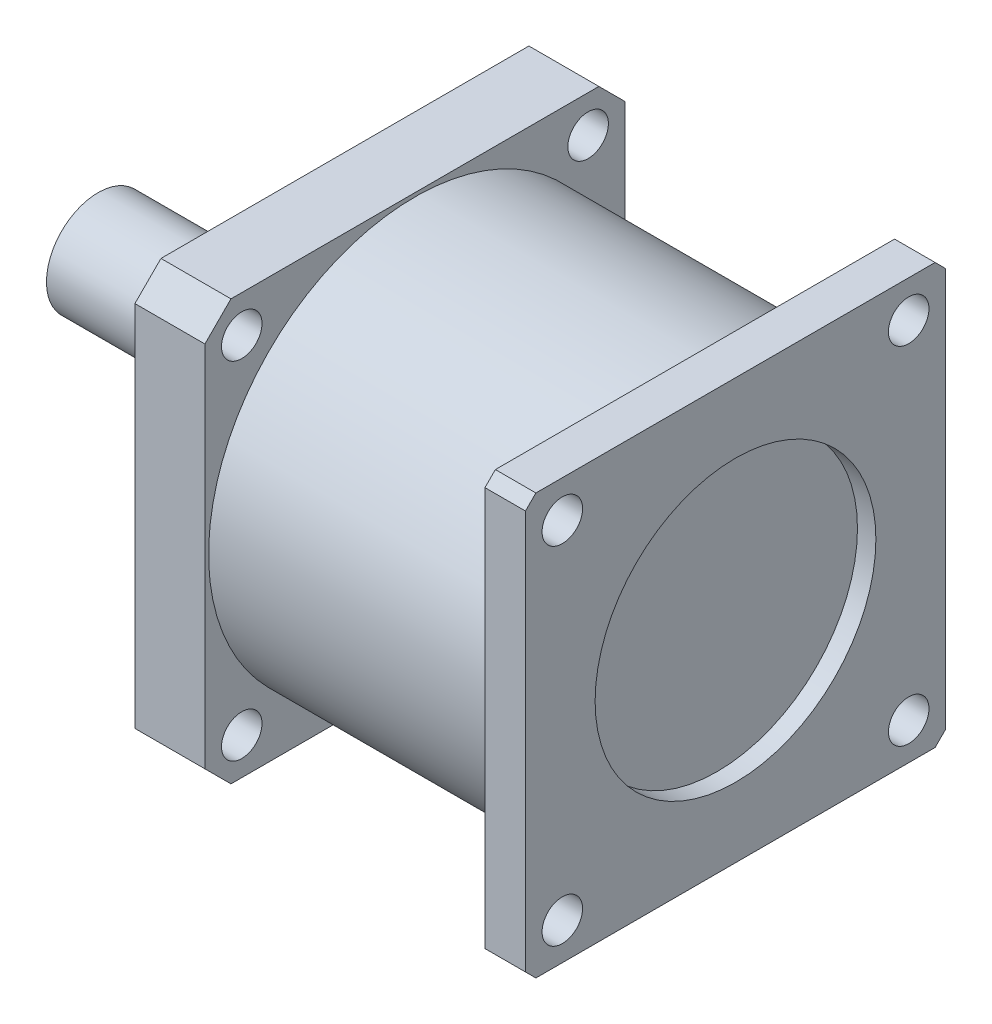
ISO-10303-21;
HEADER;
FILE_DESCRIPTION(('STEP AP214'),'2;1');
FILE_NAME('part.step','',(''),(''),'','','');
FILE_SCHEMA(('AUTOMOTIVE_DESIGN { 1 0 10303 214 1 1 1 1 }'));
ENDSEC;
DATA;
#1=APPLICATION_CONTEXT('core data for automotive mechanical design processes');
#2=APPLICATION_PROTOCOL_DEFINITION('international standard','automotive_design',2000,#1);
#3=PRODUCT_CONTEXT('',#1,'mechanical');
#4=PRODUCT('Part','Part','',(#3));
#5=PRODUCT_RELATED_PRODUCT_CATEGORY('part','',(#4));
#6=PRODUCT_DEFINITION_FORMATION('','',#4);
#7=PRODUCT_DEFINITION_CONTEXT('part definition',#1,'design');
#8=PRODUCT_DEFINITION('design','',#6,#7);
#9=PRODUCT_DEFINITION_SHAPE('','',#8);
#10=(LENGTH_UNIT() NAMED_UNIT(*) SI_UNIT(.MILLI.,.METRE.));
#11=(NAMED_UNIT(*) PLANE_ANGLE_UNIT() SI_UNIT($,.RADIAN.));
#12=(NAMED_UNIT(*) SI_UNIT($,.STERADIAN.) SOLID_ANGLE_UNIT());
#13=UNCERTAINTY_MEASURE_WITH_UNIT(LENGTH_MEASURE(1.E-05),#10,'distance_accuracy_value','');
#14=(GEOMETRIC_REPRESENTATION_CONTEXT(3) GLOBAL_UNCERTAINTY_ASSIGNED_CONTEXT((#13)) GLOBAL_UNIT_ASSIGNED_CONTEXT((#10,
#11,#12)) REPRESENTATION_CONTEXT('',''));
#15=CARTESIAN_POINT('',(0.,0.,0.));
#16=DIRECTION('',(0.,0.,1.));
#17=DIRECTION('',(1.,0.,0.));
#18=AXIS2_PLACEMENT_3D('',#15,#16,#17);
#19=CARTESIAN_POINT('',(43.5,28.5,-28.5));
#20=DIRECTION('',(0.,-1.,0.));
#21=DIRECTION('',(0.,0.,-1.));
#22=AXIS2_PLACEMENT_3D('',#19,#20,#21);
#23=PLANE('',#22);
#24=DIRECTION('',(1.,0.,0.));
#25=VECTOR('',#24,1.);
#26=CARTESIAN_POINT('',(38.,28.5000000000003,-27.0857864376266));
#27=LINE('',#26,#25);
#28=CARTESIAN_POINT('',(38.,28.5000000000003,-27.0857864376266));
#29=VERTEX_POINT('',#28);
#30=CARTESIAN_POINT('',(43.5,28.5000000000003,-27.0857864376266));
#31=VERTEX_POINT('',#30);
#32=EDGE_CURVE('E223',#29,#31,#27,.T.);
#33=ORIENTED_EDGE('',*,*,#32,.F.);
#34=DIRECTION('',(0.,0.,1.));
#35=VECTOR('',#34,1.);
#36=CARTESIAN_POINT('',(38.,28.5,-28.5));
#37=LINE('',#36,#35);
#38=CARTESIAN_POINT('',(38.,28.5,27.0857864376269));
#39=VERTEX_POINT('',#38);
#40=EDGE_CURVE('E276',#29,#39,#37,.T.);
#41=ORIENTED_EDGE('',*,*,#40,.T.);
#42=DIRECTION('',(1.,0.,0.));
#43=VECTOR('',#42,1.);
#44=CARTESIAN_POINT('',(38.,28.5,27.0857864376269));
#45=LINE('',#44,#43);
#46=CARTESIAN_POINT('',(43.5,28.5,27.0857864376269));
#47=VERTEX_POINT('',#46);
#48=EDGE_CURVE('E241',#39,#47,#45,.T.);
#49=ORIENTED_EDGE('',*,*,#48,.T.);
#50=DIRECTION('',(0.,0.,1.));
#51=VECTOR('',#50,1.);
#52=CARTESIAN_POINT('',(43.5,28.5,-28.5));
#53=LINE('',#52,#51);
#54=EDGE_CURVE('E260',#31,#47,#53,.T.);
#55=ORIENTED_EDGE('',*,*,#54,.F.);
#56=EDGE_LOOP('',(#33,#41,#49,#55));
#57=FACE_BOUND('',#56,.T.);
#58=ADVANCED_FACE('F39',(#57),#23,.F.);
#59=CARTESIAN_POINT('',(43.5,28.5,28.5));
#60=DIRECTION('',(0.,0.,-1.));
#61=DIRECTION('',(0.,1.,0.));
#62=AXIS2_PLACEMENT_3D('',#59,#60,#61);
#63=PLANE('',#62);
#64=DIRECTION('',(1.,0.,0.));
#65=VECTOR('',#64,1.);
#66=CARTESIAN_POINT('',(38.,-27.085786437627,28.4999999999999));
#67=LINE('',#66,#65);
#68=CARTESIAN_POINT('',(38.,-27.085786437627,28.4999999999999));
#69=VERTEX_POINT('',#68);
#70=CARTESIAN_POINT('',(43.5,-27.085786437627,28.4999999999999));
#71=VERTEX_POINT('',#70);
#72=EDGE_CURVE('E199',#69,#71,#67,.T.);
#73=ORIENTED_EDGE('',*,*,#72,.T.);
#74=DIRECTION('',(0.,-1.,0.));
#75=VECTOR('',#74,1.);
#76=CARTESIAN_POINT('',(43.5,28.5,28.5));
#77=LINE('',#76,#75);
#78=CARTESIAN_POINT('',(43.5,27.0857864376269,28.5));
#79=VERTEX_POINT('',#78);
#80=EDGE_CURVE('E264',#79,#71,#77,.T.);
#81=ORIENTED_EDGE('',*,*,#80,.F.);
#82=DIRECTION('',(1.,0.,0.));
#83=VECTOR('',#82,1.);
#84=CARTESIAN_POINT('',(38.,27.0857864376269,28.5));
#85=LINE('',#84,#83);
#86=CARTESIAN_POINT('',(38.,27.0857864376269,28.5));
#87=VERTEX_POINT('',#86);
#88=EDGE_CURVE('E237',#87,#79,#85,.T.);
#89=ORIENTED_EDGE('',*,*,#88,.F.);
#90=DIRECTION('',(0.,-1.,0.));
#91=VECTOR('',#90,1.);
#92=CARTESIAN_POINT('',(38.,28.5,28.5));
#93=LINE('',#92,#91);
#94=EDGE_CURVE('E279',#87,#69,#93,.T.);
#95=ORIENTED_EDGE('',*,*,#94,.T.);
#96=EDGE_LOOP('',(#73,#81,#89,#95));
#97=FACE_BOUND('',#96,.T.);
#98=ADVANCED_FACE('F461',(#97),#63,.F.);
#99=CARTESIAN_POINT('',(43.5,0.,0.));
#100=DIRECTION('',(1.,0.,0.));
#101=DIRECTION('',(0.,0.,-1.));
#102=AXIS2_PLACEMENT_3D('',#99,#100,#101);
#103=PLANE('',#102);
#104=CARTESIAN_POINT('',(43.5,-23.5000000000001,23.4999999999999));
#105=DIRECTION('',(1.,0.,0.));
#106=DIRECTION('',(0.,1.,0.));
#107=AXIS2_PLACEMENT_3D('',#104,#105,#106);
#108=CIRCLE('',#107,2.75);
#109=CARTESIAN_POINT('',(43.5,-20.7500000000001,23.4999999999999));
#110=VERTEX_POINT('',#109);
#111=EDGE_CURVE('E303',#110,#110,#108,.T.);
#112=ORIENTED_EDGE('',*,*,#111,.F.);
#113=EDGE_LOOP('',(#112));
#114=FACE_BOUND('',#113,.T.);
#115=CARTESIAN_POINT('',(43.5,-23.5,-23.5));
#116=DIRECTION('',(1.,0.,0.));
#117=DIRECTION('',(0.,0.,1.));
#118=AXIS2_PLACEMENT_3D('',#115,#116,#117);
#119=CIRCLE('',#118,2.75);
#120=CARTESIAN_POINT('',(43.5,-23.5,-20.75));
#121=VERTEX_POINT('',#120);
#122=EDGE_CURVE('E541',#121,#121,#119,.T.);
#123=ORIENTED_EDGE('',*,*,#122,.F.);
#124=EDGE_LOOP('',(#123));
#125=FACE_BOUND('',#124,.T.);
#126=CARTESIAN_POINT('',(43.5,23.5000000000002,-23.4999999999997));
#127=DIRECTION('',(1.,0.,0.));
#128=DIRECTION('',(0.,-1.,0.));
#129=AXIS2_PLACEMENT_3D('',#126,#127,#128);
#130=CIRCLE('',#129,2.75);
#131=CARTESIAN_POINT('',(43.5,20.7500000000002,-23.4999999999998));
#132=VERTEX_POINT('',#131);
#133=EDGE_CURVE('E545',#132,#132,#130,.T.);
#134=ORIENTED_EDGE('',*,*,#133,.F.);
#135=EDGE_LOOP('',(#134));
#136=FACE_BOUND('',#135,.T.);
#137=CARTESIAN_POINT('',(43.5,23.5,23.5));
#138=DIRECTION('',(1.,0.,0.));
#139=DIRECTION('',(0.,0.,-1.));
#140=AXIS2_PLACEMENT_3D('',#137,#138,#139);
#141=CIRCLE('',#140,2.75);
#142=CARTESIAN_POINT('',(43.5,23.5,20.75));
#143=VERTEX_POINT('',#142);
#144=EDGE_CURVE('E298',#143,#143,#141,.T.);
#145=ORIENTED_EDGE('',*,*,#144,.F.);
#146=EDGE_LOOP('',(#145));
#147=FACE_BOUND('',#146,.T.);
#148=CARTESIAN_POINT('',(43.5,0.,0.));
#149=DIRECTION('',(1.,0.,0.));
#150=DIRECTION('',(0.,0.,-1.));
#151=AXIS2_PLACEMENT_3D('',#148,#149,#150);
#152=CIRCLE('',#151,19.05);
#153=CARTESIAN_POINT('',(43.5,0.,-19.05));
#154=VERTEX_POINT('',#153);
#155=EDGE_CURVE('E245',#154,#154,#152,.T.);
#156=ORIENTED_EDGE('',*,*,#155,.F.);
#157=EDGE_LOOP('',(#156));
#158=FACE_BOUND('',#157,.T.);
#159=ORIENTED_EDGE('',*,*,#80,.T.);
#160=DIRECTION('',(0.,-0.707106781186552,-0.707106781186543));
#161=VECTOR('',#160,1.);
#162=CARTESIAN_POINT('',(43.5,-27.085786437627,28.4999999999999));
#163=LINE('',#162,#161);
#164=CARTESIAN_POINT('',(43.5,-28.5000000000001,27.0857864376268));
#165=VERTEX_POINT('',#164);
#166=EDGE_CURVE('E194',#71,#165,#163,.T.);
#167=ORIENTED_EDGE('',*,*,#166,.T.);
#168=DIRECTION('',(0.,0.,-1.));
#169=VECTOR('',#168,1.);
#170=CARTESIAN_POINT('',(43.5,-28.5,28.5));
#171=LINE('',#170,#169);
#172=CARTESIAN_POINT('',(43.5,-28.5,-27.0857864376269));
#173=VERTEX_POINT('',#172);
#174=EDGE_CURVE('E268',#165,#173,#171,.T.);
#175=ORIENTED_EDGE('',*,*,#174,.T.);
#176=DIRECTION('',(0.,0.707106781186541,-0.707106781186554));
#177=VECTOR('',#176,1.);
#178=CARTESIAN_POINT('',(43.5,-28.5,-27.0857864376269));
#179=LINE('',#178,#177);
#180=CARTESIAN_POINT('',(43.5,-27.0857864376269,-28.5));
#181=VERTEX_POINT('',#180);
#182=EDGE_CURVE('E210',#173,#181,#179,.T.);
#183=ORIENTED_EDGE('',*,*,#182,.T.);
#184=DIRECTION('',(0.,1.,0.));
#185=VECTOR('',#184,1.);
#186=CARTESIAN_POINT('',(43.5,-28.5,-28.5));
#187=LINE('',#186,#185);
#188=CARTESIAN_POINT('',(43.5,27.0857864376272,-28.5));
#189=VERTEX_POINT('',#188);
#190=EDGE_CURVE('E256',#181,#189,#187,.T.);
#191=ORIENTED_EDGE('',*,*,#190,.T.);
#192=DIRECTION('',(0.,0.707106781186547,0.707106781186548));
#193=VECTOR('',#192,1.);
#194=CARTESIAN_POINT('',(43.5,27.0857864376272,-28.4999999999997));
#195=LINE('',#194,#193);
#196=EDGE_CURVE('E224',#189,#31,#195,.T.);
#197=ORIENTED_EDGE('',*,*,#196,.T.);
#198=ORIENTED_EDGE('',*,*,#54,.T.);
#199=DIRECTION('',(0.,-0.707106781186541,0.707106781186554));
#200=VECTOR('',#199,1.);
#201=CARTESIAN_POINT('',(43.5,28.5,27.0857864376269));
#202=LINE('',#201,#200);
#203=EDGE_CURVE('E203',#47,#79,#202,.T.);
#204=ORIENTED_EDGE('',*,*,#203,.T.);
#205=EDGE_LOOP('',(#159,#167,#175,#183,#191,#197,#198,#204));
#206=FACE_BOUND('',#205,.T.);
#207=ADVANCED_FACE('F467',(#114,#125,#136,#147,#158,#206),#103,.T.);
#208=CARTESIAN_POINT('',(38.,0.,0.));
#209=DIRECTION('',(1.,0.,0.));
#210=DIRECTION('',(0.,0.,-1.));
#211=AXIS2_PLACEMENT_3D('',#208,#209,#210);
#212=PLANE('',#211);
#213=CARTESIAN_POINT('',(38.,-23.5000000000001,23.4999999999999));
#214=DIRECTION('',(1.,0.,0.));
#215=DIRECTION('',(0.,0.,-1.));
#216=AXIS2_PLACEMENT_3D('',#213,#214,#215);
#217=CIRCLE('',#216,2.75);
#218=CARTESIAN_POINT('',(38.,-23.5000000000001,20.7499999999999));
#219=VERTEX_POINT('',#218);
#220=EDGE_CURVE('E332',#219,#219,#217,.T.);
#221=ORIENTED_EDGE('',*,*,#220,.T.);
#222=EDGE_LOOP('',(#221));
#223=FACE_BOUND('',#222,.T.);
#224=CARTESIAN_POINT('',(38.,-23.5,-23.5));
#225=DIRECTION('',(1.,0.,0.));
#226=DIRECTION('',(0.,0.,-1.));
#227=AXIS2_PLACEMENT_3D('',#224,#225,#226);
#228=CIRCLE('',#227,2.75);
#229=CARTESIAN_POINT('',(38.,-23.5,-26.25));
#230=VERTEX_POINT('',#229);
#231=EDGE_CURVE('E314',#230,#230,#228,.T.);
#232=ORIENTED_EDGE('',*,*,#231,.T.);
#233=EDGE_LOOP('',(#232));
#234=FACE_BOUND('',#233,.T.);
#235=CARTESIAN_POINT('',(38.,23.5000000000002,-23.4999999999997));
#236=DIRECTION('',(1.,0.,0.));
#237=DIRECTION('',(0.,0.,-1.));
#238=AXIS2_PLACEMENT_3D('',#235,#236,#237);
#239=CIRCLE('',#238,2.75);
#240=CARTESIAN_POINT('',(38.,23.5000000000002,-26.2499999999997));
#241=VERTEX_POINT('',#240);
#242=EDGE_CURVE('E308',#241,#241,#239,.T.);
#243=ORIENTED_EDGE('',*,*,#242,.T.);
#244=EDGE_LOOP('',(#243));
#245=FACE_BOUND('',#244,.T.);
#246=CARTESIAN_POINT('',(38.,23.5,23.5));
#247=DIRECTION('',(1.,0.,0.));
#248=DIRECTION('',(0.,0.,-1.));
#249=AXIS2_PLACEMENT_3D('',#246,#247,#248);
#250=CIRCLE('',#249,2.75);
#251=CARTESIAN_POINT('',(38.,23.5,20.75));
#252=VERTEX_POINT('',#251);
#253=EDGE_CURVE('E342',#252,#252,#250,.T.);
#254=ORIENTED_EDGE('',*,*,#253,.T.);
#255=EDGE_LOOP('',(#254));
#256=FACE_BOUND('',#255,.T.);
#257=CARTESIAN_POINT('',(38.,0.,0.));
#258=DIRECTION('',(1.,0.,0.));
#259=DIRECTION('',(0.,0.,-1.));
#260=AXIS2_PLACEMENT_3D('',#257,#258,#259);
#261=CIRCLE('',#260,28.);
#262=CARTESIAN_POINT('',(38.,0.,-28.));
#263=VERTEX_POINT('',#262);
#264=EDGE_CURVE('E272',#263,#263,#261,.T.);
#265=ORIENTED_EDGE('',*,*,#264,.T.);
#266=EDGE_LOOP('',(#265));
#267=FACE_BOUND('',#266,.T.);
#268=DIRECTION('',(0.,-0.707106781186552,-0.707106781186543));
#269=VECTOR('',#268,1.);
#270=CARTESIAN_POINT('',(38.,-27.085786437627,28.4999999999999));
#271=LINE('',#270,#269);
#272=CARTESIAN_POINT('',(38.,-28.5,27.0857864376268));
#273=VERTEX_POINT('',#272);
#274=EDGE_CURVE('E190',#69,#273,#271,.T.);
#275=ORIENTED_EDGE('',*,*,#274,.F.);
#276=ORIENTED_EDGE('',*,*,#94,.F.);
#277=DIRECTION('',(0.,-0.707106781186541,0.707106781186554));
#278=VECTOR('',#277,1.);
#279=CARTESIAN_POINT('',(38.,28.5,27.0857864376269));
#280=LINE('',#279,#278);
#281=EDGE_CURVE('E234',#39,#87,#280,.T.);
#282=ORIENTED_EDGE('',*,*,#281,.F.);
#283=ORIENTED_EDGE('',*,*,#40,.F.);
#284=DIRECTION('',(0.,0.707106781186547,0.707106781186548));
#285=VECTOR('',#284,1.);
#286=CARTESIAN_POINT('',(38.,27.0857864376272,-28.4999999999997));
#287=LINE('',#286,#285);
#288=CARTESIAN_POINT('',(38.,27.0857864376272,-28.4999999999997));
#289=VERTEX_POINT('',#288);
#290=EDGE_CURVE('E220',#289,#29,#287,.T.);
#291=ORIENTED_EDGE('',*,*,#290,.F.);
#292=DIRECTION('',(0.,1.,0.));
#293=VECTOR('',#292,1.);
#294=CARTESIAN_POINT('',(38.,0.,-28.5));
#295=LINE('',#294,#293);
#296=CARTESIAN_POINT('',(38.,-27.0857864376269,-28.5));
#297=VERTEX_POINT('',#296);
#298=EDGE_CURVE('E252',#297,#289,#295,.T.);
#299=ORIENTED_EDGE('',*,*,#298,.F.);
#300=DIRECTION('',(0.,0.707106781186541,-0.707106781186554));
#301=VECTOR('',#300,1.);
#302=CARTESIAN_POINT('',(38.,-28.5,-27.0857864376269));
#303=LINE('',#302,#301);
#304=CARTESIAN_POINT('',(38.,-28.5,-27.0857864376269));
#305=VERTEX_POINT('',#304);
#306=EDGE_CURVE('E206',#305,#297,#303,.T.);
#307=ORIENTED_EDGE('',*,*,#306,.F.);
#308=DIRECTION('',(0.,0.,-1.));
#309=VECTOR('',#308,1.);
#310=CARTESIAN_POINT('',(38.,-28.5,28.5));
#311=LINE('',#310,#309);
#312=EDGE_CURVE('E261',#273,#305,#311,.T.);
#313=ORIENTED_EDGE('',*,*,#312,.F.);
#314=EDGE_LOOP('',(#275,#276,#282,#283,#291,#299,#307,#313));
#315=FACE_BOUND('',#314,.T.);
#316=ADVANCED_FACE('F475',(#223,#234,#245,#256,#267,#315),#212,.F.);
#317=CARTESIAN_POINT('',(43.5,0.,-28.5));
#318=DIRECTION('',(0.,0.,1.));
#319=DIRECTION('',(1.,0.,0.));
#320=AXIS2_PLACEMENT_3D('',#317,#318,#319);
#321=PLANE('',#320);
#322=DIRECTION('',(1.,0.,0.));
#323=VECTOR('',#322,1.);
#324=CARTESIAN_POINT('',(38.,-27.0857864376269,-28.5));
#325=LINE('',#324,#323);
#326=EDGE_CURVE('E209',#297,#181,#325,.T.);
#327=ORIENTED_EDGE('',*,*,#326,.F.);
#328=ORIENTED_EDGE('',*,*,#298,.T.);
#329=DIRECTION('',(1.,0.,0.));
#330=VECTOR('',#329,1.);
#331=CARTESIAN_POINT('',(38.,27.0857864376272,-28.4999999999997));
#332=LINE('',#331,#330);
#333=EDGE_CURVE('E214',#289,#189,#332,.T.);
#334=ORIENTED_EDGE('',*,*,#333,.T.);
#335=ORIENTED_EDGE('',*,*,#190,.F.);
#336=EDGE_LOOP('',(#327,#328,#334,#335));
#337=FACE_BOUND('',#336,.T.);
#338=ADVANCED_FACE('F472',(#337),#321,.F.);
#339=CARTESIAN_POINT('',(43.5,-28.5,28.5));
#340=DIRECTION('',(0.,1.,0.));
#341=DIRECTION('',(0.,0.,1.));
#342=AXIS2_PLACEMENT_3D('',#339,#340,#341);
#343=PLANE('',#342);
#344=DIRECTION('',(1.,0.,0.));
#345=VECTOR('',#344,1.);
#346=CARTESIAN_POINT('',(38.,-28.5000000000001,27.0857864376268));
#347=LINE('',#346,#345);
#348=EDGE_CURVE('E193',#273,#165,#347,.T.);
#349=ORIENTED_EDGE('',*,*,#348,.F.);
#350=ORIENTED_EDGE('',*,*,#312,.T.);
#351=DIRECTION('',(1.,0.,0.));
#352=VECTOR('',#351,1.);
#353=CARTESIAN_POINT('',(38.,-28.5,-27.0857864376269));
#354=LINE('',#353,#352);
#355=EDGE_CURVE('E198',#305,#173,#354,.T.);
#356=ORIENTED_EDGE('',*,*,#355,.T.);
#357=ORIENTED_EDGE('',*,*,#174,.F.);
#358=EDGE_LOOP('',(#349,#350,#356,#357));
#359=FACE_BOUND('',#358,.T.);
#360=ADVANCED_FACE('F474',(#359),#343,.F.);
#361=CARTESIAN_POINT('',(38.,0.,0.));
#362=DIRECTION('',(-1.,0.,0.));
#363=DIRECTION('',(0.,0.,1.));
#364=AXIS2_PLACEMENT_3D('',#361,#362,#363);
#365=CYLINDRICAL_SURFACE('',#364,28.);
#366=ORIENTED_EDGE('',*,*,#264,.F.);
#367=EDGE_LOOP('',(#366));
#368=FACE_BOUND('',#367,.T.);
#369=CARTESIAN_POINT('',(0.,0.,0.));
#370=DIRECTION('',(1.,0.,0.));
#371=DIRECTION('',(0.,0.,-1.));
#372=AXIS2_PLACEMENT_3D('',#369,#370,#371);
#373=CIRCLE('',#372,28.);
#374=CARTESIAN_POINT('',(0.,0.,-28.));
#375=VERTEX_POINT('',#374);
#376=EDGE_CURVE('E228',#375,#375,#373,.T.);
#377=ORIENTED_EDGE('',*,*,#376,.T.);
#378=EDGE_LOOP('',(#377));
#379=FACE_BOUND('',#378,.T.);
#380=ADVANCED_FACE('F41',(#368,#379),#365,.T.);
#381=CARTESIAN_POINT('',(41.,0.,0.));
#382=DIRECTION('',(1.,0.,0.));
#383=DIRECTION('',(0.,0.,-1.));
#384=AXIS2_PLACEMENT_3D('',#381,#382,#383);
#385=CYLINDRICAL_SURFACE('',#384,19.05);
#386=CARTESIAN_POINT('',(41.,0.,0.));
#387=DIRECTION('',(1.,0.,0.));
#388=DIRECTION('',(0.,0.,-1.));
#389=AXIS2_PLACEMENT_3D('',#386,#387,#388);
#390=CIRCLE('',#389,19.05);
#391=CARTESIAN_POINT('',(41.,0.,-19.05));
#392=VERTEX_POINT('',#391);
#393=EDGE_CURVE('E248',#392,#392,#390,.T.);
#394=ORIENTED_EDGE('',*,*,#393,.F.);
#395=EDGE_LOOP('',(#394));
#396=FACE_BOUND('',#395,.T.);
#397=ORIENTED_EDGE('',*,*,#155,.T.);
#398=EDGE_LOOP('',(#397));
#399=FACE_BOUND('',#398,.T.);
#400=ADVANCED_FACE('F526',(#396,#399),#385,.F.);
#401=CARTESIAN_POINT('',(41.,0.,0.));
#402=DIRECTION('',(1.,0.,0.));
#403=DIRECTION('',(0.,0.,-1.));
#404=AXIS2_PLACEMENT_3D('',#401,#402,#403);
#405=PLANE('',#404);
#406=ORIENTED_EDGE('',*,*,#393,.T.);
#407=EDGE_LOOP('',(#406));
#408=FACE_BOUND('',#407,.T.);
#409=ADVANCED_FACE('F518',(#408),#405,.T.);
#410=CARTESIAN_POINT('',(38.,28.5,27.0857864376269));
#411=DIRECTION('',(0.,0.707106781186554,0.707106781186541));
#412=DIRECTION('',(0.,-0.707106781186541,0.707106781186554));
#413=AXIS2_PLACEMENT_3D('',#410,#411,#412);
#414=PLANE('',#413);
#415=ORIENTED_EDGE('',*,*,#203,.F.);
#416=ORIENTED_EDGE('',*,*,#48,.F.);
#417=ORIENTED_EDGE('',*,*,#281,.T.);
#418=ORIENTED_EDGE('',*,*,#88,.T.);
#419=EDGE_LOOP('',(#415,#416,#417,#418));
#420=FACE_BOUND('',#419,.T.);
#421=ADVANCED_FACE('F503',(#420),#414,.T.);
#422=CARTESIAN_POINT('',(38.,-28.5,-27.0857864376269));
#423=DIRECTION('',(0.,-0.707106781186554,-0.707106781186541));
#424=DIRECTION('',(0.,0.707106781186541,-0.707106781186554));
#425=AXIS2_PLACEMENT_3D('',#422,#423,#424);
#426=PLANE('',#425);
#427=ORIENTED_EDGE('',*,*,#182,.F.);
#428=ORIENTED_EDGE('',*,*,#355,.F.);
#429=ORIENTED_EDGE('',*,*,#306,.T.);
#430=ORIENTED_EDGE('',*,*,#326,.T.);
#431=EDGE_LOOP('',(#427,#428,#429,#430));
#432=FACE_BOUND('',#431,.T.);
#433=ADVANCED_FACE('F510',(#432),#426,.T.);
#434=CARTESIAN_POINT('',(38.,-27.085786437627,28.4999999999999));
#435=DIRECTION('',(0.,-0.707106781186543,0.707106781186552));
#436=DIRECTION('',(0.,-0.707106781186552,-0.707106781186543));
#437=AXIS2_PLACEMENT_3D('',#434,#435,#436);
#438=PLANE('',#437);
#439=ORIENTED_EDGE('',*,*,#166,.F.);
#440=ORIENTED_EDGE('',*,*,#72,.F.);
#441=ORIENTED_EDGE('',*,*,#274,.T.);
#442=ORIENTED_EDGE('',*,*,#348,.T.);
#443=EDGE_LOOP('',(#439,#440,#441,#442));
#444=FACE_BOUND('',#443,.T.);
#445=ADVANCED_FACE('F508',(#444),#438,.T.);
#446=CARTESIAN_POINT('',(38.,27.0857864376272,-28.4999999999997));
#447=DIRECTION('',(0.,0.707106781186548,-0.707106781186547));
#448=DIRECTION('',(0.,0.707106781186547,0.707106781186548));
#449=AXIS2_PLACEMENT_3D('',#446,#447,#448);
#450=PLANE('',#449);
#451=ORIENTED_EDGE('',*,*,#196,.F.);
#452=ORIENTED_EDGE('',*,*,#333,.F.);
#453=ORIENTED_EDGE('',*,*,#290,.T.);
#454=ORIENTED_EDGE('',*,*,#32,.T.);
#455=EDGE_LOOP('',(#451,#452,#453,#454));
#456=FACE_BOUND('',#455,.T.);
#457=ADVANCED_FACE('F496',(#456),#450,.T.);
#458=CARTESIAN_POINT('',(-9.5,28.5000000000003,-28.5));
#459=DIRECTION('',(0.,-1.,0.));
#460=DIRECTION('',(0.,0.,-1.));
#461=AXIS2_PLACEMENT_3D('',#458,#459,#460);
#462=PLANE('',#461);
#463=DIRECTION('',(0.,0.,-1.));
#464=VECTOR('',#463,1.);
#465=CARTESIAN_POINT('',(-9.5,28.5000000000003,-28.5));
#466=LINE('',#465,#464);
#467=CARTESIAN_POINT('',(-9.5,28.5000000000003,24.9644660940673));
#468=VERTEX_POINT('',#467);
#469=CARTESIAN_POINT('',(-9.5,28.5000000000003,-24.9644660940673));
#470=VERTEX_POINT('',#469);
#471=EDGE_CURVE('E418',#468,#470,#466,.T.);
#472=ORIENTED_EDGE('',*,*,#471,.F.);
#473=DIRECTION('',(-1.,0.,0.));
#474=VECTOR('',#473,1.);
#475=CARTESIAN_POINT('',(0.,28.5000000000003,24.9644660940673));
#476=LINE('',#475,#474);
#477=CARTESIAN_POINT('',(0.,28.5000000000003,24.9644660940673));
#478=VERTEX_POINT('',#477);
#479=EDGE_CURVE('E393',#478,#468,#476,.T.);
#480=ORIENTED_EDGE('',*,*,#479,.F.);
#481=DIRECTION('',(0.,0.,-1.));
#482=VECTOR('',#481,1.);
#483=CARTESIAN_POINT('',(0.,28.5000000000003,-28.5));
#484=LINE('',#483,#482);
#485=CARTESIAN_POINT('',(0.,28.5000000000003,-24.9644660940673));
#486=VERTEX_POINT('',#485);
#487=EDGE_CURVE('E186',#478,#486,#484,.T.);
#488=ORIENTED_EDGE('',*,*,#487,.T.);
#489=DIRECTION('',(-1.,0.,0.));
#490=VECTOR('',#489,1.);
#491=CARTESIAN_POINT('',(0.,28.5000000000003,-24.9644660940673));
#492=LINE('',#491,#490);
#493=EDGE_CURVE('E409',#486,#470,#492,.T.);
#494=ORIENTED_EDGE('',*,*,#493,.T.);
#495=EDGE_LOOP('',(#472,#480,#488,#494));
#496=FACE_BOUND('',#495,.T.);
#497=ADVANCED_FACE('F432',(#496),#462,.F.);
#498=CARTESIAN_POINT('',(-9.5,-28.5,-28.5));
#499=DIRECTION('',(0.,0.,1.));
#500=DIRECTION('',(1.,0.,0.));
#501=AXIS2_PLACEMENT_3D('',#498,#499,#500);
#502=PLANE('',#501);
#503=DIRECTION('',(0.,-1.,0.));
#504=VECTOR('',#503,1.);
#505=CARTESIAN_POINT('',(0.,-28.5,-28.5));
#506=LINE('',#505,#504);
#507=CARTESIAN_POINT('',(0.,24.9644660940676,-28.5));
#508=VERTEX_POINT('',#507);
#509=CARTESIAN_POINT('',(0.,-24.9644660940676,-28.5));
#510=VERTEX_POINT('',#509);
#511=EDGE_CURVE('E179',#508,#510,#506,.T.);
#512=ORIENTED_EDGE('',*,*,#511,.T.);
#513=DIRECTION('',(-1.,0.,0.));
#514=VECTOR('',#513,1.);
#515=CARTESIAN_POINT('',(0.,-24.9644660940674,-28.5000000000002));
#516=LINE('',#515,#514);
#517=CARTESIAN_POINT('',(-9.5,-24.9644660940674,-28.5000000000002));
#518=VERTEX_POINT('',#517);
#519=EDGE_CURVE('E57',#510,#518,#516,.T.);
#520=ORIENTED_EDGE('',*,*,#519,.T.);
#521=DIRECTION('',(0.,-1.,0.));
#522=VECTOR('',#521,1.);
#523=CARTESIAN_POINT('',(-9.5,-28.5,-28.5));
#524=LINE('',#523,#522);
#525=CARTESIAN_POINT('',(-9.5,24.9644660940676,-28.5));
#526=VERTEX_POINT('',#525);
#527=EDGE_CURVE('E421',#526,#518,#524,.T.);
#528=ORIENTED_EDGE('',*,*,#527,.F.);
#529=DIRECTION('',(-1.,0.,0.));
#530=VECTOR('',#529,1.);
#531=CARTESIAN_POINT('',(0.,24.9644660940676,-28.5));
#532=LINE('',#531,#530);
#533=EDGE_CURVE('E405',#508,#526,#532,.T.);
#534=ORIENTED_EDGE('',*,*,#533,.F.);
#535=EDGE_LOOP('',(#512,#520,#528,#534));
#536=FACE_BOUND('',#535,.T.);
#537=ADVANCED_FACE('F438',(#536),#502,.F.);
#538=CARTESIAN_POINT('',(-9.5,-28.5,28.4999999999999));
#539=DIRECTION('',(0.,1.,0.));
#540=DIRECTION('',(0.,0.,1.));
#541=AXIS2_PLACEMENT_3D('',#538,#539,#540);
#542=PLANE('',#541);
#543=DIRECTION('',(0.,0.,1.));
#544=VECTOR('',#543,1.);
#545=CARTESIAN_POINT('',(-9.5,-28.5,28.4999999999999));
#546=LINE('',#545,#544);
#547=CARTESIAN_POINT('',(-9.5,-28.5000000000001,-24.9644660940675));
#548=VERTEX_POINT('',#547);
#549=CARTESIAN_POINT('',(-9.5,-28.5000000000003,24.9644660940673));
#550=VERTEX_POINT('',#549);
#551=EDGE_CURVE('E170',#548,#550,#546,.T.);
#552=ORIENTED_EDGE('',*,*,#551,.F.);
#553=DIRECTION('',(-1.,0.,0.));
#554=VECTOR('',#553,1.);
#555=CARTESIAN_POINT('',(0.,-28.5000000000001,-24.9644660940675));
#556=LINE('',#555,#554);
#557=CARTESIAN_POINT('',(0.,-28.5000000000001,-24.9644660940675));
#558=VERTEX_POINT('',#557);
#559=EDGE_CURVE('E155',#558,#548,#556,.T.);
#560=ORIENTED_EDGE('',*,*,#559,.F.);
#561=DIRECTION('',(0.,0.,1.));
#562=VECTOR('',#561,1.);
#563=CARTESIAN_POINT('',(0.,-28.5,28.4999999999999));
#564=LINE('',#563,#562);
#565=CARTESIAN_POINT('',(0.,-28.5,24.9644660940675));
#566=VERTEX_POINT('',#565);
#567=EDGE_CURVE('E168',#558,#566,#564,.T.);
#568=ORIENTED_EDGE('',*,*,#567,.T.);
#569=DIRECTION('',(-1.,0.,0.));
#570=VECTOR('',#569,1.);
#571=CARTESIAN_POINT('',(0.,-28.5000000000003,24.9644660940673));
#572=LINE('',#571,#570);
#573=EDGE_CURVE('E65',#566,#550,#572,.T.);
#574=ORIENTED_EDGE('',*,*,#573,.T.);
#575=EDGE_LOOP('',(#552,#560,#568,#574));
#576=FACE_BOUND('',#575,.T.);
#577=ADVANCED_FACE('F167',(#576),#542,.F.);
#578=CARTESIAN_POINT('',(-9.5,0.,28.5));
#579=DIRECTION('',(0.,0.,-1.));
#580=DIRECTION('',(0.,1.,0.));
#581=AXIS2_PLACEMENT_3D('',#578,#579,#580);
#582=PLANE('',#581);
#583=DIRECTION('',(0.,1.,0.));
#584=VECTOR('',#583,1.);
#585=CARTESIAN_POINT('',(-9.5,28.5,28.5));
#586=LINE('',#585,#584);
#587=CARTESIAN_POINT('',(-9.5,-24.9644660940676,28.5));
#588=VERTEX_POINT('',#587);
#589=CARTESIAN_POINT('',(-9.5,24.9644660940676,28.5));
#590=VERTEX_POINT('',#589);
#591=EDGE_CURVE('E184',#588,#590,#586,.T.);
#592=ORIENTED_EDGE('',*,*,#591,.F.);
#593=DIRECTION('',(-1.,0.,0.));
#594=VECTOR('',#593,1.);
#595=CARTESIAN_POINT('',(0.,-24.9644660940676,28.5));
#596=LINE('',#595,#594);
#597=CARTESIAN_POINT('',(0.,-24.9644660940676,28.5));
#598=VERTEX_POINT('',#597);
#599=EDGE_CURVE('E380',#598,#588,#596,.T.);
#600=ORIENTED_EDGE('',*,*,#599,.F.);
#601=DIRECTION('',(0.,1.,0.));
#602=VECTOR('',#601,1.);
#603=CARTESIAN_POINT('',(0.,0.,28.5));
#604=LINE('',#603,#602);
#605=CARTESIAN_POINT('',(0.,24.9644660940676,28.5));
#606=VERTEX_POINT('',#605);
#607=EDGE_CURVE('E178',#598,#606,#604,.T.);
#608=ORIENTED_EDGE('',*,*,#607,.T.);
#609=DIRECTION('',(-1.,0.,0.));
#610=VECTOR('',#609,1.);
#611=CARTESIAN_POINT('',(0.,24.9644660940676,28.5));
#612=LINE('',#611,#610);
#613=EDGE_CURVE('E384',#606,#590,#612,.T.);
#614=ORIENTED_EDGE('',*,*,#613,.T.);
#615=EDGE_LOOP('',(#592,#600,#608,#614));
#616=FACE_BOUND('',#615,.T.);
#617=ADVANCED_FACE('F448',(#616),#582,.F.);
#618=CARTESIAN_POINT('',(-9.5,0.,0.));
#619=DIRECTION('',(1.,0.,0.));
#620=DIRECTION('',(0.,0.,-1.));
#621=AXIS2_PLACEMENT_3D('',#618,#619,#620);
#622=PLANE('',#621);
#623=CARTESIAN_POINT('',(-9.5,-23.5000000000001,23.4999999999999));
#624=DIRECTION('',(1.,0.,0.));
#625=DIRECTION('',(0.,0.,-1.));
#626=AXIS2_PLACEMENT_3D('',#623,#624,#625);
#627=CIRCLE('',#626,2.75);
#628=CARTESIAN_POINT('',(-9.5,-23.5000000000001,20.7499999999999));
#629=VERTEX_POINT('',#628);
#630=EDGE_CURVE('E328',#629,#629,#627,.T.);
#631=ORIENTED_EDGE('',*,*,#630,.T.);
#632=EDGE_LOOP('',(#631));
#633=FACE_BOUND('',#632,.T.);
#634=CARTESIAN_POINT('',(-9.5,-23.5,-23.5));
#635=DIRECTION('',(1.,0.,0.));
#636=DIRECTION('',(0.,0.,-1.));
#637=AXIS2_PLACEMENT_3D('',#634,#635,#636);
#638=CIRCLE('',#637,2.75);
#639=CARTESIAN_POINT('',(-9.5,-23.5,-26.25));
#640=VERTEX_POINT('',#639);
#641=EDGE_CURVE('E307',#640,#640,#638,.T.);
#642=ORIENTED_EDGE('',*,*,#641,.T.);
#643=EDGE_LOOP('',(#642));
#644=FACE_BOUND('',#643,.T.);
#645=CARTESIAN_POINT('',(-9.5,23.5000000000002,-23.4999999999997));
#646=DIRECTION('',(1.,0.,0.));
#647=DIRECTION('',(0.,0.,-1.));
#648=AXIS2_PLACEMENT_3D('',#645,#646,#647);
#649=CIRCLE('',#648,2.75);
#650=CARTESIAN_POINT('',(-9.5,23.5000000000002,-26.2499999999997));
#651=VERTEX_POINT('',#650);
#652=EDGE_CURVE('E302',#651,#651,#649,.T.);
#653=ORIENTED_EDGE('',*,*,#652,.T.);
#654=EDGE_LOOP('',(#653));
#655=FACE_BOUND('',#654,.T.);
#656=CARTESIAN_POINT('',(-9.5,23.5,23.5));
#657=DIRECTION('',(1.,0.,0.));
#658=DIRECTION('',(0.,0.,-1.));
#659=AXIS2_PLACEMENT_3D('',#656,#657,#658);
#660=CIRCLE('',#659,2.75);
#661=CARTESIAN_POINT('',(-9.5,23.5,20.75));
#662=VERTEX_POINT('',#661);
#663=EDGE_CURVE('E297',#662,#662,#660,.T.);
#664=ORIENTED_EDGE('',*,*,#663,.T.);
#665=EDGE_LOOP('',(#664));
#666=FACE_BOUND('',#665,.T.);
#667=CARTESIAN_POINT('',(-9.5,0.,0.));
#668=DIRECTION('',(-1.,0.,0.));
#669=DIRECTION('',(0.,0.,1.));
#670=AXIS2_PLACEMENT_3D('',#667,#668,#669);
#671=CIRCLE('',#670,20.);
#672=CARTESIAN_POINT('',(-9.5,0.,20.));
#673=VERTEX_POINT('',#672);
#674=EDGE_CURVE('E289',#673,#673,#671,.T.);
#675=ORIENTED_EDGE('',*,*,#674,.F.);
#676=EDGE_LOOP('',(#675));
#677=FACE_BOUND('',#676,.T.);
#678=ORIENTED_EDGE('',*,*,#527,.T.);
#679=DIRECTION('',(0.,0.707106781186547,-0.707106781186548));
#680=VECTOR('',#679,1.);
#681=CARTESIAN_POINT('',(-9.5,-24.9644660940674,-28.5000000000002));
#682=LINE('',#681,#680);
#683=EDGE_CURVE('E162',#548,#518,#682,.T.);
#684=ORIENTED_EDGE('',*,*,#683,.F.);
#685=ORIENTED_EDGE('',*,*,#551,.T.);
#686=DIRECTION('',(0.,-0.707106781186545,-0.70710678118655));
#687=VECTOR('',#686,1.);
#688=CARTESIAN_POINT('',(-9.5,-28.5000000000003,24.9644660940673));
#689=LINE('',#688,#687);
#690=EDGE_CURVE('E381',#588,#550,#689,.T.);
#691=ORIENTED_EDGE('',*,*,#690,.F.);
#692=ORIENTED_EDGE('',*,*,#591,.T.);
#693=DIRECTION('',(0.,-0.707106781186542,0.707106781186553));
#694=VECTOR('',#693,1.);
#695=CARTESIAN_POINT('',(-9.5,24.9644660940676,28.5));
#696=LINE('',#695,#694);
#697=EDGE_CURVE('E369',#468,#590,#696,.T.);
#698=ORIENTED_EDGE('',*,*,#697,.F.);
#699=ORIENTED_EDGE('',*,*,#471,.T.);
#700=DIRECTION('',(0.,0.707106781186545,0.70710678118655));
#701=VECTOR('',#700,1.);
#702=CARTESIAN_POINT('',(-9.5,28.5000000000003,-24.9644660940673));
#703=LINE('',#702,#701);
#704=EDGE_CURVE('E376',#526,#470,#703,.T.);
#705=ORIENTED_EDGE('',*,*,#704,.F.);
#706=EDGE_LOOP('',(#678,#684,#685,#691,#692,#698,#699,#705));
#707=FACE_BOUND('',#706,.T.);
#708=ADVANCED_FACE('F441',(#633,#644,#655,#666,#677,#707),#622,.F.);
#709=CARTESIAN_POINT('',(0.,0.,0.));
#710=DIRECTION('',(1.,0.,0.));
#711=DIRECTION('',(0.,0.,-1.));
#712=AXIS2_PLACEMENT_3D('',#709,#710,#711);
#713=PLANE('',#712);
#714=CARTESIAN_POINT('',(0.,-23.5000000000001,23.4999999999999));
#715=DIRECTION('',(1.,0.,0.));
#716=DIRECTION('',(0.,0.,-1.));
#717=AXIS2_PLACEMENT_3D('',#714,#715,#716);
#718=CIRCLE('',#717,2.75);
#719=CARTESIAN_POINT('',(0.,-23.5000000000001,20.7499999999999));
#720=VERTEX_POINT('',#719);
#721=EDGE_CURVE('E43',#720,#720,#718,.T.);
#722=ORIENTED_EDGE('',*,*,#721,.F.);
#723=EDGE_LOOP('',(#722));
#724=FACE_BOUND('',#723,.T.);
#725=CARTESIAN_POINT('',(0.,-23.5,-23.5));
#726=DIRECTION('',(1.,0.,0.));
#727=DIRECTION('',(0.,0.,-1.));
#728=AXIS2_PLACEMENT_3D('',#725,#726,#727);
#729=CIRCLE('',#728,2.75);
#730=CARTESIAN_POINT('',(0.,-23.5,-26.25));
#731=VERTEX_POINT('',#730);
#732=EDGE_CURVE('E304',#731,#731,#729,.T.);
#733=ORIENTED_EDGE('',*,*,#732,.F.);
#734=EDGE_LOOP('',(#733));
#735=FACE_BOUND('',#734,.T.);
#736=CARTESIAN_POINT('',(0.,23.5000000000002,-23.4999999999997));
#737=DIRECTION('',(1.,0.,0.));
#738=DIRECTION('',(0.,0.,-1.));
#739=AXIS2_PLACEMENT_3D('',#736,#737,#738);
#740=CIRCLE('',#739,2.75);
#741=CARTESIAN_POINT('',(0.,23.5000000000002,-26.2499999999997));
#742=VERTEX_POINT('',#741);
#743=EDGE_CURVE('E299',#742,#742,#740,.T.);
#744=ORIENTED_EDGE('',*,*,#743,.F.);
#745=EDGE_LOOP('',(#744));
#746=FACE_BOUND('',#745,.T.);
#747=CARTESIAN_POINT('',(0.,23.5,23.5));
#748=DIRECTION('',(1.,0.,0.));
#749=DIRECTION('',(0.,0.,-1.));
#750=AXIS2_PLACEMENT_3D('',#747,#748,#749);
#751=CIRCLE('',#750,2.75);
#752=CARTESIAN_POINT('',(0.,23.5,20.75));
#753=VERTEX_POINT('',#752);
#754=EDGE_CURVE('E293',#753,#753,#751,.T.);
#755=ORIENTED_EDGE('',*,*,#754,.F.);
#756=EDGE_LOOP('',(#755));
#757=FACE_BOUND('',#756,.T.);
#758=DIRECTION('',(0.,0.707106781186547,-0.707106781186548));
#759=VECTOR('',#758,1.);
#760=CARTESIAN_POINT('',(0.,-24.9644660940674,-28.5000000000002));
#761=LINE('',#760,#759);
#762=EDGE_CURVE('E152',#558,#510,#761,.T.);
#763=ORIENTED_EDGE('',*,*,#762,.T.);
#764=ORIENTED_EDGE('',*,*,#511,.F.);
#765=DIRECTION('',(0.,0.707106781186545,0.70710678118655));
#766=VECTOR('',#765,1.);
#767=CARTESIAN_POINT('',(0.,28.5000000000003,-24.9644660940673));
#768=LINE('',#767,#766);
#769=EDGE_CURVE('E401',#508,#486,#768,.T.);
#770=ORIENTED_EDGE('',*,*,#769,.T.);
#771=ORIENTED_EDGE('',*,*,#487,.F.);
#772=DIRECTION('',(0.,-0.707106781186542,0.707106781186553));
#773=VECTOR('',#772,1.);
#774=CARTESIAN_POINT('',(0.,24.9644660940676,28.5));
#775=LINE('',#774,#773);
#776=EDGE_CURVE('E389',#478,#606,#775,.T.);
#777=ORIENTED_EDGE('',*,*,#776,.T.);
#778=ORIENTED_EDGE('',*,*,#607,.F.);
#779=DIRECTION('',(0.,-0.707106781186545,-0.70710678118655));
#780=VECTOR('',#779,1.);
#781=CARTESIAN_POINT('',(0.,-28.5000000000003,24.9644660940673));
#782=LINE('',#781,#780);
#783=EDGE_CURVE('E176',#598,#566,#782,.T.);
#784=ORIENTED_EDGE('',*,*,#783,.T.);
#785=ORIENTED_EDGE('',*,*,#567,.F.);
#786=EDGE_LOOP('',(#763,#764,#770,#771,#777,#778,#784,#785));
#787=FACE_BOUND('',#786,.T.);
#788=ORIENTED_EDGE('',*,*,#376,.F.);
#789=EDGE_LOOP('',(#788));
#790=FACE_BOUND('',#789,.T.);
#791=ADVANCED_FACE('F173',(#724,#735,#746,#757,#787,#790),#713,.T.);
#792=CARTESIAN_POINT('',(0.,28.5000000000003,-24.9644660940673));
#793=DIRECTION('',(0.,-0.70710678118655,0.707106781186546));
#794=DIRECTION('',(0.,-0.707106781186546,-0.70710678118655));
#795=AXIS2_PLACEMENT_3D('',#792,#793,#794);
#796=PLANE('',#795);
#797=ORIENTED_EDGE('',*,*,#704,.T.);
#798=ORIENTED_EDGE('',*,*,#493,.F.);
#799=ORIENTED_EDGE('',*,*,#769,.F.);
#800=ORIENTED_EDGE('',*,*,#533,.T.);
#801=EDGE_LOOP('',(#797,#798,#799,#800));
#802=FACE_BOUND('',#801,.T.);
#803=ADVANCED_FACE('F434',(#802),#796,.F.);
#804=CARTESIAN_POINT('',(0.,24.9644660940676,28.5));
#805=DIRECTION('',(0.,-0.707106781186553,-0.707106781186542));
#806=DIRECTION('',(0.,0.707106781186542,-0.707106781186553));
#807=AXIS2_PLACEMENT_3D('',#804,#805,#806);
#808=PLANE('',#807);
#809=ORIENTED_EDGE('',*,*,#697,.T.);
#810=ORIENTED_EDGE('',*,*,#613,.F.);
#811=ORIENTED_EDGE('',*,*,#776,.F.);
#812=ORIENTED_EDGE('',*,*,#479,.T.);
#813=EDGE_LOOP('',(#809,#810,#811,#812));
#814=FACE_BOUND('',#813,.T.);
#815=ADVANCED_FACE('F446',(#814),#808,.F.);
#816=CARTESIAN_POINT('',(0.,-28.5000000000003,24.9644660940673));
#817=DIRECTION('',(0.,0.70710678118655,-0.707106781186546));
#818=DIRECTION('',(0.,0.707106781186546,0.70710678118655));
#819=AXIS2_PLACEMENT_3D('',#816,#817,#818);
#820=PLANE('',#819);
#821=ORIENTED_EDGE('',*,*,#690,.T.);
#822=ORIENTED_EDGE('',*,*,#573,.F.);
#823=ORIENTED_EDGE('',*,*,#783,.F.);
#824=ORIENTED_EDGE('',*,*,#599,.T.);
#825=EDGE_LOOP('',(#821,#822,#823,#824));
#826=FACE_BOUND('',#825,.T.);
#827=ADVANCED_FACE('F450',(#826),#820,.F.);
#828=CARTESIAN_POINT('',(0.,-24.9644660940674,-28.5000000000002));
#829=DIRECTION('',(0.,0.707106781186548,0.707106781186547));
#830=DIRECTION('',(0.,-0.707106781186547,0.707106781186548));
#831=AXIS2_PLACEMENT_3D('',#828,#829,#830);
#832=PLANE('',#831);
#833=ORIENTED_EDGE('',*,*,#683,.T.);
#834=ORIENTED_EDGE('',*,*,#519,.F.);
#835=ORIENTED_EDGE('',*,*,#762,.F.);
#836=ORIENTED_EDGE('',*,*,#559,.T.);
#837=EDGE_LOOP('',(#833,#834,#835,#836));
#838=FACE_BOUND('',#837,.T.);
#839=ADVANCED_FACE('F154',(#838),#832,.F.);
#840=CARTESIAN_POINT('',(-12.,0.,0.));
#841=DIRECTION('',(1.,0.,0.));
#842=DIRECTION('',(0.,0.,-1.));
#843=AXIS2_PLACEMENT_3D('',#840,#841,#842);
#844=CYLINDRICAL_SURFACE('',#843,20.);
#845=CARTESIAN_POINT('',(-12.,0.,0.));
#846=DIRECTION('',(-1.,0.,0.));
#847=DIRECTION('',(0.,0.,1.));
#848=AXIS2_PLACEMENT_3D('',#845,#846,#847);
#849=CIRCLE('',#848,20.);
#850=CARTESIAN_POINT('',(-12.,0.,20.));
#851=VERTEX_POINT('',#850);
#852=EDGE_CURVE('E362',#851,#851,#849,.T.);
#853=ORIENTED_EDGE('',*,*,#852,.F.);
#854=EDGE_LOOP('',(#853));
#855=FACE_BOUND('',#854,.T.);
#856=ORIENTED_EDGE('',*,*,#674,.T.);
#857=EDGE_LOOP('',(#856));
#858=FACE_BOUND('',#857,.T.);
#859=ADVANCED_FACE('F457',(#855,#858),#844,.T.);
#860=CARTESIAN_POINT('',(-12.,0.,0.));
#861=DIRECTION('',(-1.,0.,0.));
#862=DIRECTION('',(0.,0.,1.));
#863=AXIS2_PLACEMENT_3D('',#860,#861,#862);
#864=PLANE('',#863);
#865=CARTESIAN_POINT('',(-12.,0.,0.));
#866=DIRECTION('',(-1.,0.,0.));
#867=DIRECTION('',(0.,0.,1.));
#868=AXIS2_PLACEMENT_3D('',#865,#866,#867);
#869=CIRCLE('',#868,7.5);
#870=CARTESIAN_POINT('',(-12.,0.,7.5));
#871=VERTEX_POINT('',#870);
#872=EDGE_CURVE('E49',#871,#871,#869,.T.);
#873=ORIENTED_EDGE('',*,*,#872,.F.);
#874=EDGE_LOOP('',(#873));
#875=FACE_BOUND('',#874,.T.);
#876=ORIENTED_EDGE('',*,*,#852,.T.);
#877=EDGE_LOOP('',(#876));
#878=FACE_BOUND('',#877,.T.);
#879=ADVANCED_FACE('F699',(#875,#878),#864,.T.);
#880=CARTESIAN_POINT('',(-13.,0.,0.));
#881=DIRECTION('',(1.,0.,0.));
#882=DIRECTION('',(0.,0.,-1.));
#883=AXIS2_PLACEMENT_3D('',#880,#881,#882);
#884=CYLINDRICAL_SURFACE('',#883,7.5);
#885=CARTESIAN_POINT('',(-13.,0.,0.));
#886=DIRECTION('',(-1.,0.,0.));
#887=DIRECTION('',(0.,0.,1.));
#888=AXIS2_PLACEMENT_3D('',#885,#886,#887);
#889=CIRCLE('',#888,7.5);
#890=CARTESIAN_POINT('',(-13.,0.,7.5));
#891=VERTEX_POINT('',#890);
#892=EDGE_CURVE('E357',#891,#891,#889,.T.);
#893=ORIENTED_EDGE('',*,*,#892,.F.);
#894=EDGE_LOOP('',(#893));
#895=FACE_BOUND('',#894,.T.);
#896=ORIENTED_EDGE('',*,*,#872,.T.);
#897=EDGE_LOOP('',(#896));
#898=FACE_BOUND('',#897,.T.);
#899=ADVANCED_FACE('F695',(#895,#898),#884,.T.);
#900=CARTESIAN_POINT('',(-13.,0.,0.));
#901=DIRECTION('',(-1.,0.,0.));
#902=DIRECTION('',(0.,0.,1.));
#903=AXIS2_PLACEMENT_3D('',#900,#901,#902);
#904=PLANE('',#903);
#905=CARTESIAN_POINT('',(-13.,0.,0.));
#906=DIRECTION('',(-1.,0.,0.));
#907=DIRECTION('',(0.,0.,1.));
#908=AXIS2_PLACEMENT_3D('',#905,#906,#907);
#909=CIRCLE('',#908,7.);
#910=CARTESIAN_POINT('',(-13.,0.,7.));
#911=VERTEX_POINT('',#910);
#912=EDGE_CURVE('E11',#911,#911,#909,.T.);
#913=ORIENTED_EDGE('',*,*,#912,.F.);
#914=EDGE_LOOP('',(#913));
#915=FACE_BOUND('',#914,.T.);
#916=ORIENTED_EDGE('',*,*,#892,.T.);
#917=EDGE_LOOP('',(#916));
#918=FACE_BOUND('',#917,.T.);
#919=ADVANCED_FACE('F691',(#915,#918),#904,.T.);
#920=CARTESIAN_POINT('',(-43.,0.,0.));
#921=DIRECTION('',(1.,0.,0.));
#922=DIRECTION('',(0.,0.,-1.));
#923=AXIS2_PLACEMENT_3D('',#920,#921,#922);
#924=CYLINDRICAL_SURFACE('',#923,7.);
#925=CARTESIAN_POINT('',(-43.,0.,0.));
#926=DIRECTION('',(-1.,0.,0.));
#927=DIRECTION('',(0.,0.,1.));
#928=AXIS2_PLACEMENT_3D('',#925,#926,#927);
#929=CIRCLE('',#928,7.);
#930=CARTESIAN_POINT('',(-43.,0.,7.));
#931=VERTEX_POINT('',#930);
#932=EDGE_CURVE('E351',#931,#931,#929,.T.);
#933=ORIENTED_EDGE('',*,*,#932,.F.);
#934=EDGE_LOOP('',(#933));
#935=FACE_BOUND('',#934,.T.);
#936=ORIENTED_EDGE('',*,*,#912,.T.);
#937=EDGE_LOOP('',(#936));
#938=FACE_BOUND('',#937,.T.);
#939=ADVANCED_FACE('F687',(#935,#938),#924,.T.);
#940=CARTESIAN_POINT('',(-43.,0.,0.));
#941=DIRECTION('',(-1.,0.,0.));
#942=DIRECTION('',(0.,0.,1.));
#943=AXIS2_PLACEMENT_3D('',#940,#941,#942);
#944=PLANE('',#943);
#945=CARTESIAN_POINT('',(-43.,0.,0.));
#946=DIRECTION('',(-1.,0.,0.));
#947=DIRECTION('',(0.,0.,1.));
#948=AXIS2_PLACEMENT_3D('',#945,#946,#947);
#949=CIRCLE('',#948,2.);
#950=CARTESIAN_POINT('',(-43.,0.,2.));
#951=VERTEX_POINT('',#950);
#952=EDGE_CURVE('E346',#951,#951,#949,.T.);
#953=ORIENTED_EDGE('',*,*,#952,.F.);
#954=EDGE_LOOP('',(#953));
#955=FACE_BOUND('',#954,.T.);
#956=ORIENTED_EDGE('',*,*,#932,.T.);
#957=EDGE_LOOP('',(#956));
#958=FACE_BOUND('',#957,.T.);
#959=ADVANCED_FACE('F683',(#955,#958),#944,.T.);
#960=CARTESIAN_POINT('',(-33.,0.,0.));
#961=DIRECTION('',(-1.,0.,0.));
#962=DIRECTION('',(0.,0.,1.));
#963=AXIS2_PLACEMENT_3D('',#960,#961,#962);
#964=CYLINDRICAL_SURFACE('',#963,2.);
#965=CARTESIAN_POINT('',(-33.,0.,0.));
#966=DIRECTION('',(-1.,0.,0.));
#967=DIRECTION('',(0.,0.,1.));
#968=AXIS2_PLACEMENT_3D('',#965,#966,#967);
#969=CIRCLE('',#968,2.);
#970=CARTESIAN_POINT('',(-33.,0.,2.));
#971=VERTEX_POINT('',#970);
#972=EDGE_CURVE('E347',#971,#971,#969,.T.);
#973=ORIENTED_EDGE('',*,*,#972,.F.);
#974=EDGE_LOOP('',(#973));
#975=FACE_BOUND('',#974,.T.);
#976=ORIENTED_EDGE('',*,*,#952,.T.);
#977=EDGE_LOOP('',(#976));
#978=FACE_BOUND('',#977,.T.);
#979=ADVANCED_FACE('F679',(#975,#978),#964,.F.);
#980=CARTESIAN_POINT('',(-33.,0.,0.));
#981=DIRECTION('',(-1.,0.,0.));
#982=DIRECTION('',(0.,0.,1.));
#983=AXIS2_PLACEMENT_3D('',#980,#981,#982);
#984=PLANE('',#983);
#985=ORIENTED_EDGE('',*,*,#972,.T.);
#986=EDGE_LOOP('',(#985));
#987=FACE_BOUND('',#986,.T.);
#988=ADVANCED_FACE('F676',(#987),#984,.T.);
#989=CARTESIAN_POINT('',(-16.5,23.5,23.5));
#990=DIRECTION('',(1.,0.,0.));
#991=DIRECTION('',(0.,0.,-1.));
#992=AXIS2_PLACEMENT_3D('',#989,#990,#991);
#993=CYLINDRICAL_SURFACE('',#992,2.75);
#994=ORIENTED_EDGE('',*,*,#754,.T.);
#995=EDGE_LOOP('',(#994));
#996=FACE_BOUND('',#995,.T.);
#997=ORIENTED_EDGE('',*,*,#663,.F.);
#998=EDGE_LOOP('',(#997));
#999=FACE_BOUND('',#998,.T.);
#1000=ADVANCED_FACE('F555',(#996,#999),#993,.F.);
#1001=ORIENTED_EDGE('',*,*,#144,.T.);
#1002=EDGE_LOOP('',(#1001));
#1003=FACE_BOUND('',#1002,.T.);
#1004=ORIENTED_EDGE('',*,*,#253,.F.);
#1005=EDGE_LOOP('',(#1004));
#1006=FACE_BOUND('',#1005,.T.);
#1007=ADVANCED_FACE('F551',(#1003,#1006),#993,.F.);
#1008=CARTESIAN_POINT('',(-16.5,23.5000000000002,-23.4999999999997));
#1009=DIRECTION('',(1.,0.,0.));
#1010=DIRECTION('',(0.,0.,-1.));
#1011=AXIS2_PLACEMENT_3D('',#1008,#1009,#1010);
#1012=CYLINDRICAL_SURFACE('',#1011,2.75);
#1013=ORIENTED_EDGE('',*,*,#743,.T.);
#1014=EDGE_LOOP('',(#1013));
#1015=FACE_BOUND('',#1014,.T.);
#1016=ORIENTED_EDGE('',*,*,#652,.F.);
#1017=EDGE_LOOP('',(#1016));
#1018=FACE_BOUND('',#1017,.T.);
#1019=ADVANCED_FACE('F554',(#1015,#1018),#1012,.F.);
#1020=CARTESIAN_POINT('',(-16.5,-23.5,-23.5));
#1021=DIRECTION('',(1.,0.,0.));
#1022=DIRECTION('',(0.,0.,-1.));
#1023=AXIS2_PLACEMENT_3D('',#1020,#1021,#1022);
#1024=CYLINDRICAL_SURFACE('',#1023,2.75);
#1025=ORIENTED_EDGE('',*,*,#732,.T.);
#1026=EDGE_LOOP('',(#1025));
#1027=FACE_BOUND('',#1026,.T.);
#1028=ORIENTED_EDGE('',*,*,#641,.F.);
#1029=EDGE_LOOP('',(#1028));
#1030=FACE_BOUND('',#1029,.T.);
#1031=ADVANCED_FACE('F623',(#1027,#1030),#1024,.F.);
#1032=CARTESIAN_POINT('',(-16.5,-23.5000000000001,23.4999999999999));
#1033=DIRECTION('',(1.,0.,0.));
#1034=DIRECTION('',(0.,0.,-1.));
#1035=AXIS2_PLACEMENT_3D('',#1032,#1033,#1034);
#1036=CYLINDRICAL_SURFACE('',#1035,2.75);
#1037=ORIENTED_EDGE('',*,*,#721,.T.);
#1038=EDGE_LOOP('',(#1037));
#1039=FACE_BOUND('',#1038,.T.);
#1040=ORIENTED_EDGE('',*,*,#630,.F.);
#1041=EDGE_LOOP('',(#1040));
#1042=FACE_BOUND('',#1041,.T.);
#1043=ADVANCED_FACE('F635',(#1039,#1042),#1036,.F.);
#1044=ORIENTED_EDGE('',*,*,#133,.T.);
#1045=EDGE_LOOP('',(#1044));
#1046=FACE_BOUND('',#1045,.T.);
#1047=ORIENTED_EDGE('',*,*,#242,.F.);
#1048=EDGE_LOOP('',(#1047));
#1049=FACE_BOUND('',#1048,.T.);
#1050=ADVANCED_FACE('F626',(#1046,#1049),#1012,.F.);
#1051=ORIENTED_EDGE('',*,*,#122,.T.);
#1052=EDGE_LOOP('',(#1051));
#1053=FACE_BOUND('',#1052,.T.);
#1054=ORIENTED_EDGE('',*,*,#231,.F.);
#1055=EDGE_LOOP('',(#1054));
#1056=FACE_BOUND('',#1055,.T.);
#1057=ADVANCED_FACE('F637',(#1053,#1056),#1024,.F.);
#1058=ORIENTED_EDGE('',*,*,#111,.T.);
#1059=EDGE_LOOP('',(#1058));
#1060=FACE_BOUND('',#1059,.T.);
#1061=ORIENTED_EDGE('',*,*,#220,.F.);
#1062=EDGE_LOOP('',(#1061));
#1063=FACE_BOUND('',#1062,.T.);
#1064=ADVANCED_FACE('F647',(#1060,#1063),#1036,.F.);
#1065=CLOSED_SHELL('',(#58,#98,#207,#316,#338,#360,#380,#400,#409,#421,#433,#445,#457,#497,#537,
#577,#617,#708,#791,#803,#815,#827,#839,#859,#879,#899,#919,#939,#959,#979,#988,#1000,#1007,
#1019,#1031,#1043,#1050,#1057,#1064));
#1066=MANIFOLD_SOLID_BREP('B2',#1065);
#1067=ADVANCED_BREP_SHAPE_REPRESENTATION('',(#18,#1066),#14);
#1068=SHAPE_DEFINITION_REPRESENTATION(#9,#1067);
ENDSEC;
END-ISO-10303-21;
